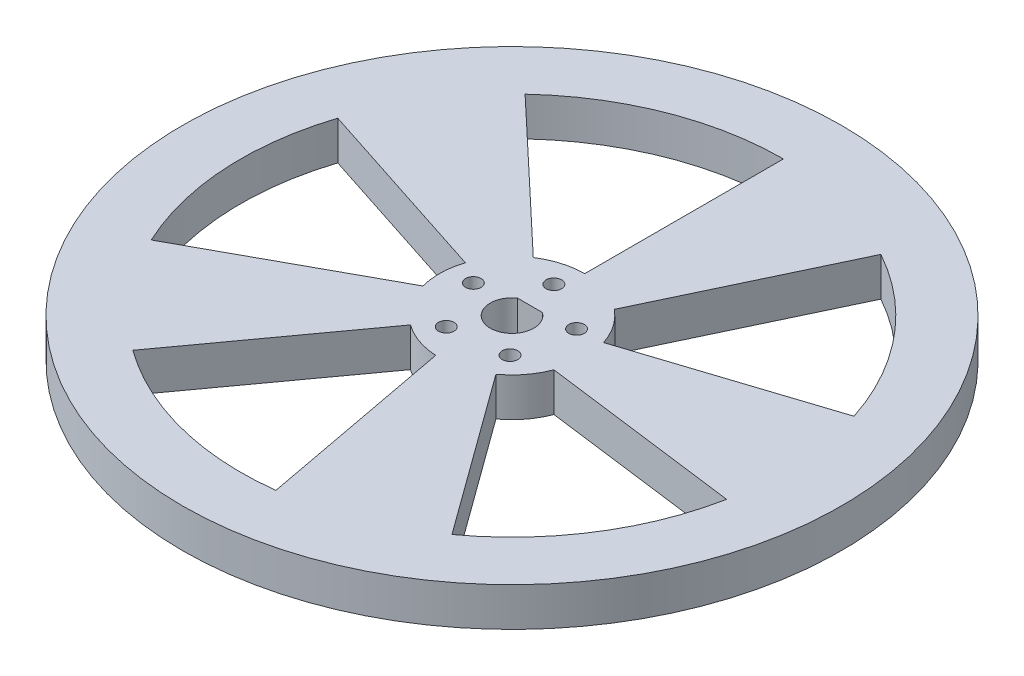
ISO-10303-21;
HEADER;
FILE_DESCRIPTION(('STEP AP214'),'2;1');
FILE_NAME('part.step','',(''),(''),'','','');
FILE_SCHEMA(('AUTOMOTIVE_DESIGN { 1 0 10303 214 1 1 1 1 }'));
ENDSEC;
DATA;
#1=APPLICATION_CONTEXT('core data for automotive mechanical design processes');
#2=APPLICATION_PROTOCOL_DEFINITION('international standard','automotive_design',2000,#1);
#3=PRODUCT_CONTEXT('',#1,'mechanical');
#4=PRODUCT('Part','Part','',(#3));
#5=PRODUCT_RELATED_PRODUCT_CATEGORY('part','',(#4));
#6=PRODUCT_DEFINITION_FORMATION('','',#4);
#7=PRODUCT_DEFINITION_CONTEXT('part definition',#1,'design');
#8=PRODUCT_DEFINITION('design','',#6,#7);
#9=PRODUCT_DEFINITION_SHAPE('','',#8);
#10=(LENGTH_UNIT() NAMED_UNIT(*) SI_UNIT(.MILLI.,.METRE.));
#11=(NAMED_UNIT(*) PLANE_ANGLE_UNIT() SI_UNIT($,.RADIAN.));
#12=(NAMED_UNIT(*) SI_UNIT($,.STERADIAN.) SOLID_ANGLE_UNIT());
#13=UNCERTAINTY_MEASURE_WITH_UNIT(LENGTH_MEASURE(1.E-05),#10,'distance_accuracy_value','');
#14=(GEOMETRIC_REPRESENTATION_CONTEXT(3) GLOBAL_UNCERTAINTY_ASSIGNED_CONTEXT((#13)) GLOBAL_UNIT_ASSIGNED_CONTEXT((#10,
#11,#12)) REPRESENTATION_CONTEXT('',''));
#15=CARTESIAN_POINT('',(0.,0.,0.));
#16=DIRECTION('',(0.,0.,1.));
#17=DIRECTION('',(1.,0.,0.));
#18=AXIS2_PLACEMENT_3D('',#15,#16,#17);
#19=CARTESIAN_POINT('',(0.,5.08,0.));
#20=DIRECTION('',(0.,1.,0.));
#21=DIRECTION('',(0.,0.,1.));
#22=AXIS2_PLACEMENT_3D('',#19,#20,#21);
#23=PLANE('',#22);
#24=CARTESIAN_POINT('',(-0.812554258388851,5.08,-6.29779767674178));
#25=DIRECTION('',(0.,1.,0.));
#26=DIRECTION('',(0.,0.,1.));
#27=AXIS2_PLACEMENT_3D('',#24,#25,#26);
#28=CIRCLE('',#27,1.016);
#29=CARTESIAN_POINT('',(-0.812554258388851,5.08,-5.28179767674178));
#30=VERTEX_POINT('',#29);
#31=EDGE_CURVE('E612',#30,#30,#28,.T.);
#32=ORIENTED_EDGE('',*,*,#31,.F.);
#33=EDGE_LOOP('',(#32));
#34=FACE_BOUND('',#33,.T.);
#35=CARTESIAN_POINT('',(-6.24065459346764,5.08,-1.17334148696418));
#36=DIRECTION('',(0.,1.,0.));
#37=DIRECTION('',(0.,0.,1.));
#38=AXIS2_PLACEMENT_3D('',#35,#36,#37);
#39=CIRCLE('',#38,1.016);
#40=CARTESIAN_POINT('',(-6.24065459346764,5.08,-0.15734148696418));
#41=VERTEX_POINT('',#40);
#42=EDGE_CURVE('E606',#41,#41,#39,.T.);
#43=ORIENTED_EDGE('',*,*,#42,.F.);
#44=EDGE_LOOP('',(#43));
#45=FACE_BOUND('',#44,.T.);
#46=CARTESIAN_POINT('',(-3.04438239242231,5.08,5.57263275738758));
#47=DIRECTION('',(0.,1.,0.));
#48=DIRECTION('',(0.,0.,1.));
#49=AXIS2_PLACEMENT_3D('',#46,#47,#48);
#50=CIRCLE('',#49,1.016);
#51=CARTESIAN_POINT('',(-3.04438239242231,5.08,6.58863275738758));
#52=VERTEX_POINT('',#51);
#53=EDGE_CURVE('E598',#52,#52,#50,.T.);
#54=ORIENTED_EDGE('',*,*,#53,.F.);
#55=EDGE_LOOP('',(#54));
#56=FACE_BOUND('',#55,.T.);
#57=CARTESIAN_POINT('',(4.35912280019893,5.08,4.61741793785075));
#58=DIRECTION('',(0.,1.,0.));
#59=DIRECTION('',(0.,0.,1.));
#60=AXIS2_PLACEMENT_3D('',#57,#58,#59);
#61=CIRCLE('',#60,1.016);
#62=CARTESIAN_POINT('',(4.35912280019893,5.08,5.63341793785075));
#63=VERTEX_POINT('',#62);
#64=EDGE_CURVE('E592',#63,#63,#61,.T.);
#65=ORIENTED_EDGE('',*,*,#64,.F.);
#66=EDGE_LOOP('',(#65));
#67=FACE_BOUND('',#66,.T.);
#68=CARTESIAN_POINT('',(5.73846844407986,5.08,-2.71891153153236));
#69=DIRECTION('',(0.,1.,0.));
#70=DIRECTION('',(0.,0.,1.));
#71=AXIS2_PLACEMENT_3D('',#68,#69,#70);
#72=CIRCLE('',#71,1.016);
#73=CARTESIAN_POINT('',(5.73846844407986,5.08,-1.70291153153236));
#74=VERTEX_POINT('',#73);
#75=EDGE_CURVE('E263',#74,#74,#72,.T.);
#76=ORIENTED_EDGE('',*,*,#75,.F.);
#77=EDGE_LOOP('',(#76));
#78=FACE_BOUND('',#77,.T.);
#79=CARTESIAN_POINT('',(0.,5.08,0.));
#80=DIRECTION('',(0.,1.,0.));
#81=DIRECTION('',(0.,0.,1.));
#82=AXIS2_PLACEMENT_3D('',#79,#80,#81);
#83=CIRCLE('',#82,43.18);
#84=CARTESIAN_POINT('',(0.,5.08,43.18));
#85=VERTEX_POINT('',#84);
#86=EDGE_CURVE('E12',#85,#85,#83,.T.);
#87=ORIENTED_EDGE('',*,*,#86,.T.);
#88=EDGE_LOOP('',(#87));
#89=FACE_BOUND('',#88,.T.);
#90=CARTESIAN_POINT('',(0.,5.08,0.));
#91=DIRECTION('',(0.,1.,0.));
#92=DIRECTION('',(0.,0.,1.));
#93=AXIS2_PLACEMENT_3D('',#90,#91,#92);
#94=CIRCLE('',#93,2.8575);
#95=CARTESIAN_POINT('',(-1.62639355630794,5.08,-2.3495));
#96=VERTEX_POINT('',#95);
#97=CARTESIAN_POINT('',(1.62639355630794,5.08,-2.3495));
#98=VERTEX_POINT('',#97);
#99=EDGE_CURVE('E402',#96,#98,#94,.T.);
#100=ORIENTED_EDGE('',*,*,#99,.F.);
#101=DIRECTION('',(1.,0.,0.));
#102=VECTOR('',#101,1.);
#103=CARTESIAN_POINT('',(0.,5.08,-2.3495));
#104=LINE('',#103,#102);
#105=EDGE_CURVE('E391',#96,#98,#104,.T.);
#106=ORIENTED_EDGE('',*,*,#105,.T.);
#107=EDGE_LOOP('',(#100,#106));
#108=FACE_BOUND('',#107,.T.);
#109=DIRECTION('',(0.951056516295154,0.,0.309016994374946));
#110=VECTOR('',#109,1.);
#111=CARTESIAN_POINT('',(0.,5.08,0.));
#112=LINE('',#111,#110);
#113=CARTESIAN_POINT('',(-33.8195697194556,5.08,-10.9886443199731));
#114=VERTEX_POINT('',#113);
#115=CARTESIAN_POINT('',(-9.05881331771133,5.08,-2.94338687142136));
#116=VERTEX_POINT('',#115);
#117=EDGE_CURVE('E381',#114,#116,#112,.T.);
#118=ORIENTED_EDGE('',*,*,#117,.T.);
#119=CARTESIAN_POINT('',(0.,5.08,0.));
#120=DIRECTION('',(0.,1.,0.));
#121=DIRECTION('',(0.,0.,1.));
#122=AXIS2_PLACEMENT_3D('',#119,#120,#121);
#123=CIRCLE('',#122,9.525);
#124=CARTESIAN_POINT('',(-9.19796228792312,5.08,2.47449282681197));
#125=VERTEX_POINT('',#124);
#126=EDGE_CURVE('E276',#116,#125,#123,.T.);
#127=ORIENTED_EDGE('',*,*,#126,.T.);
#128=DIRECTION('',(0.877518030629021,0.,-0.479543643395431));
#129=VECTOR('',#128,1.);
#130=CARTESIAN_POINT('',(-1.07389592150175,5.08,-1.9651246494778));
#131=LINE('',#130,#129);
#132=CARTESIAN_POINT('',(-32.2164981681078,5.08,15.0535990973688));
#133=VERTEX_POINT('',#132);
#134=EDGE_CURVE('E370',#133,#125,#131,.T.);
#135=ORIENTED_EDGE('',*,*,#134,.F.);
#136=CARTESIAN_POINT('',(0.,5.08,0.));
#137=DIRECTION('',(0.,1.,0.));
#138=DIRECTION('',(0.,0.,1.));
#139=AXIS2_PLACEMENT_3D('',#136,#137,#138);
#140=CIRCLE('',#139,35.56);
#141=EDGE_CURVE('E384',#114,#133,#140,.T.);
#142=ORIENTED_EDGE('',*,*,#141,.F.);
#143=EDGE_LOOP('',(#118,#127,#135,#142));
#144=FACE_BOUND('',#143,.T.);
#145=DIRECTION('',(0.587785252292471,0.,-0.809016994374949));
#146=VECTOR('',#145,1.);
#147=CARTESIAN_POINT('',(0.,5.08,0.));
#148=LINE('',#147,#146);
#149=CARTESIAN_POINT('',(-20.9016435715203,5.08,28.7686443199732));
#150=VERTEX_POINT('',#149);
#151=CARTESIAN_POINT('',(-5.59865452808579,5.08,7.70588687142138));
#152=VERTEX_POINT('',#151);
#153=EDGE_CURVE('E269',#150,#152,#148,.T.);
#154=ORIENTED_EDGE('',*,*,#153,.T.);
#155=CARTESIAN_POINT('',(0.,5.08,0.));
#156=DIRECTION('',(0.,1.,0.));
#157=DIRECTION('',(0.,0.,1.));
#158=AXIS2_PLACEMENT_3D('',#155,#156,#157);
#159=CIRCLE('',#158,9.525);
#160=CARTESIAN_POINT('',(-0.488944133122985,5.08,9.51244230651018));
#161=VERTEX_POINT('',#160);
#162=EDGE_CURVE('E250',#152,#161,#159,.T.);
#163=ORIENTED_EDGE('',*,*,#162,.T.);
#164=DIRECTION('',(-0.184905122564339,0.,-0.982756376549889));
#165=VECTOR('',#164,1.);
#166=CARTESIAN_POINT('',(-2.20079669315207,5.08,0.414078801213269));
#167=LINE('',#166,#165);
#168=CARTESIAN_POINT('',(4.36137808205273,5.08,35.2915284625842));
#169=VERTEX_POINT('',#168);
#170=EDGE_CURVE('E257',#169,#161,#167,.T.);
#171=ORIENTED_EDGE('',*,*,#170,.F.);
#172=CARTESIAN_POINT('',(0.,5.08,0.));
#173=DIRECTION('',(0.,1.,0.));
#174=DIRECTION('',(0.,0.,1.));
#175=AXIS2_PLACEMENT_3D('',#172,#173,#174);
#176=CIRCLE('',#175,35.56);
#177=EDGE_CURVE('E260',#150,#169,#176,.T.);
#178=ORIENTED_EDGE('',*,*,#177,.F.);
#179=EDGE_LOOP('',(#154,#163,#171,#178));
#180=FACE_BOUND('',#179,.T.);
#181=DIRECTION('',(-0.587785252292475,0.,-0.809016994374946));
#182=VECTOR('',#181,1.);
#183=CARTESIAN_POINT('',(0.,5.08,0.));
#184=LINE('',#183,#182);
#185=CARTESIAN_POINT('',(20.9016435715204,5.08,28.7686443199731));
#186=VERTEX_POINT('',#185);
#187=CARTESIAN_POINT('',(5.59865452808581,5.08,7.70588687142136));
#188=VERTEX_POINT('',#187);
#189=EDGE_CURVE('E295',#186,#188,#184,.T.);
#190=ORIENTED_EDGE('',*,*,#189,.T.);
#191=CARTESIAN_POINT('',(0.,5.08,0.));
#192=DIRECTION('',(0.,1.,0.));
#193=DIRECTION('',(0.,0.,1.));
#194=AXIS2_PLACEMENT_3D('',#191,#192,#193);
#195=CIRCLE('',#194,9.525);
#196=CARTESIAN_POINT('',(8.89497678424152,5.08,3.40661312857861));
#197=VERTEX_POINT('',#196);
#198=EDGE_CURVE('E292',#188,#197,#195,.T.);
#199=ORIENTED_EDGE('',*,*,#198,.T.);
#200=DIRECTION('',(-0.991639136550545,0.,-0.129041942256348));
#201=VECTOR('',#200,1.);
#202=CARTESIAN_POINT('',(-0.287802994944483,5.08,2.21165853840337));
#203=LINE('',#202,#201);
#204=CARTESIAN_POINT('',(34.9054592868704,5.08,6.79135568002683));
#205=VERTEX_POINT('',#204);
#206=EDGE_CURVE('E283',#205,#197,#203,.T.);
#207=ORIENTED_EDGE('',*,*,#206,.F.);
#208=CARTESIAN_POINT('',(0.,5.08,0.));
#209=DIRECTION('',(0.,1.,0.));
#210=DIRECTION('',(0.,0.,1.));
#211=AXIS2_PLACEMENT_3D('',#208,#209,#210);
#212=CIRCLE('',#211,35.56);
#213=EDGE_CURVE('E299',#186,#205,#212,.T.);
#214=ORIENTED_EDGE('',*,*,#213,.F.);
#215=EDGE_LOOP('',(#190,#199,#207,#214));
#216=FACE_BOUND('',#215,.T.);
#217=DIRECTION('',(-0.951056516295153,0.,0.309016994374949));
#218=VECTOR('',#217,1.);
#219=CARTESIAN_POINT('',(0.,5.08,0.));
#220=LINE('',#219,#218);
#221=CARTESIAN_POINT('',(33.8195697194556,5.08,-10.9886443199732));
#222=VERTEX_POINT('',#221);
#223=CARTESIAN_POINT('',(9.05881331771133,5.08,-2.94338687142138));
#224=VERTEX_POINT('',#223);
#225=EDGE_CURVE('E324',#222,#224,#220,.T.);
#226=ORIENTED_EDGE('',*,*,#225,.T.);
#227=CARTESIAN_POINT('',(0.,5.08,0.));
#228=DIRECTION('',(0.,1.,0.));
#229=DIRECTION('',(0.,0.,1.));
#230=AXIS2_PLACEMENT_3D('',#227,#228,#229);
#231=CIRCLE('',#230,9.525);
#232=CARTESIAN_POINT('',(5.98683741404609,5.08,-7.40833333333333));
#233=VERTEX_POINT('',#232);
#234=EDGE_CURVE('E104',#224,#233,#231,.T.);
#235=ORIENTED_EDGE('',*,*,#234,.T.);
#236=DIRECTION('',(-0.42805831823088,0.,0.903751114075856));
#237=VECTOR('',#236,1.);
#238=CARTESIAN_POINT('',(2.02387133856432,5.08,0.958599052336888));
#239=LINE('',#238,#237);
#240=CARTESIAN_POINT('',(17.2154109738919,5.08,-31.115));
#241=VERTEX_POINT('',#240);
#242=EDGE_CURVE('E314',#241,#233,#239,.T.);
#243=ORIENTED_EDGE('',*,*,#242,.F.);
#244=CARTESIAN_POINT('',(0.,5.08,0.));
#245=DIRECTION('',(0.,1.,0.));
#246=DIRECTION('',(0.,0.,1.));
#247=AXIS2_PLACEMENT_3D('',#244,#245,#246);
#248=CIRCLE('',#247,35.56);
#249=EDGE_CURVE('E328',#222,#241,#248,.T.);
#250=ORIENTED_EDGE('',*,*,#249,.F.);
#251=EDGE_LOOP('',(#226,#235,#243,#250));
#252=FACE_BOUND('',#251,.T.);
#253=DIRECTION('',(0.,0.,1.));
#254=VECTOR('',#253,1.);
#255=CARTESIAN_POINT('',(0.,5.08,0.));
#256=LINE('',#255,#254);
#257=CARTESIAN_POINT('',(0.,5.08,-35.56));
#258=VERTEX_POINT('',#257);
#259=CARTESIAN_POINT('',(0.,5.08,-9.52499999999999));
#260=VERTEX_POINT('',#259);
#261=EDGE_CURVE('E352',#258,#260,#256,.T.);
#262=ORIENTED_EDGE('',*,*,#261,.T.);
#263=CARTESIAN_POINT('',(0.,5.08,0.));
#264=DIRECTION('',(0.,1.,0.));
#265=DIRECTION('',(0.,0.,1.));
#266=AXIS2_PLACEMENT_3D('',#263,#264,#265);
#267=CIRCLE('',#266,9.525);
#268=CARTESIAN_POINT('',(-5.19570918805325,5.08,-7.98312163462256));
#269=VERTEX_POINT('',#268);
#270=EDGE_CURVE('E96',#260,#269,#267,.T.);
#271=ORIENTED_EDGE('',*,*,#270,.T.);
#272=DIRECTION('',(0.727241091233947,0.,0.686382105842554));
#273=VECTOR('',#272,1.);
#274=CARTESIAN_POINT('',(1.5370925132841,5.08,-1.62859262672077));
#275=LINE('',#274,#273);
#276=CARTESIAN_POINT('',(-24.2722689484421,5.08,-25.9878925673955));
#277=VERTEX_POINT('',#276);
#278=EDGE_CURVE('E342',#277,#269,#275,.T.);
#279=ORIENTED_EDGE('',*,*,#278,.F.);
#280=CARTESIAN_POINT('',(0.,5.08,0.));
#281=DIRECTION('',(0.,1.,0.));
#282=DIRECTION('',(0.,0.,1.));
#283=AXIS2_PLACEMENT_3D('',#280,#281,#282);
#284=CIRCLE('',#283,35.56);
#285=EDGE_CURVE('E356',#258,#277,#284,.T.);
#286=ORIENTED_EDGE('',*,*,#285,.F.);
#287=EDGE_LOOP('',(#262,#271,#279,#286));
#288=FACE_BOUND('',#287,.T.);
#289=ADVANCED_FACE('F81',(#34,#45,#56,#67,#78,#89,#108,#144,#180,#216,#252,#288),#23,.T.);
#290=CARTESIAN_POINT('',(0.,0.,0.));
#291=DIRECTION('',(0.,1.,0.));
#292=DIRECTION('',(0.,0.,1.));
#293=AXIS2_PLACEMENT_3D('',#290,#291,#292);
#294=PLANE('',#293);
#295=CARTESIAN_POINT('',(-0.812554258388851,0.,-6.29779767674178));
#296=DIRECTION('',(0.,1.,0.));
#297=DIRECTION('',(0.,0.,1.));
#298=AXIS2_PLACEMENT_3D('',#295,#296,#297);
#299=CIRCLE('',#298,1.016);
#300=CARTESIAN_POINT('',(-0.812554258388851,0.,-5.28179767674178));
#301=VERTEX_POINT('',#300);
#302=EDGE_CURVE('E609',#301,#301,#299,.T.);
#303=ORIENTED_EDGE('',*,*,#302,.T.);
#304=EDGE_LOOP('',(#303));
#305=FACE_BOUND('',#304,.T.);
#306=CARTESIAN_POINT('',(-6.24065459346764,0.,-1.17334148696418));
#307=DIRECTION('',(0.,1.,0.));
#308=DIRECTION('',(0.,0.,1.));
#309=AXIS2_PLACEMENT_3D('',#306,#307,#308);
#310=CIRCLE('',#309,1.016);
#311=CARTESIAN_POINT('',(-6.24065459346764,0.,-0.15734148696418));
#312=VERTEX_POINT('',#311);
#313=EDGE_CURVE('E603',#312,#312,#310,.T.);
#314=ORIENTED_EDGE('',*,*,#313,.T.);
#315=EDGE_LOOP('',(#314));
#316=FACE_BOUND('',#315,.T.);
#317=CARTESIAN_POINT('',(-3.04438239242231,0.,5.57263275738758));
#318=DIRECTION('',(0.,1.,0.));
#319=DIRECTION('',(0.,0.,1.));
#320=AXIS2_PLACEMENT_3D('',#317,#318,#319);
#321=CIRCLE('',#320,1.016);
#322=CARTESIAN_POINT('',(-3.04438239242231,0.,6.58863275738758));
#323=VERTEX_POINT('',#322);
#324=EDGE_CURVE('E594',#323,#323,#321,.T.);
#325=ORIENTED_EDGE('',*,*,#324,.T.);
#326=EDGE_LOOP('',(#325));
#327=FACE_BOUND('',#326,.T.);
#328=CARTESIAN_POINT('',(4.35912280019893,0.,4.61741793785075));
#329=DIRECTION('',(0.,1.,0.));
#330=DIRECTION('',(0.,0.,1.));
#331=AXIS2_PLACEMENT_3D('',#328,#329,#330);
#332=CIRCLE('',#331,1.016);
#333=CARTESIAN_POINT('',(4.35912280019893,0.,5.63341793785075));
#334=VERTEX_POINT('',#333);
#335=EDGE_CURVE('E589',#334,#334,#332,.T.);
#336=ORIENTED_EDGE('',*,*,#335,.T.);
#337=EDGE_LOOP('',(#336));
#338=FACE_BOUND('',#337,.T.);
#339=CARTESIAN_POINT('',(5.73846844407986,0.,-2.71891153153236));
#340=DIRECTION('',(0.,1.,0.));
#341=DIRECTION('',(0.,0.,1.));
#342=AXIS2_PLACEMENT_3D('',#339,#340,#341);
#343=CIRCLE('',#342,1.016);
#344=CARTESIAN_POINT('',(5.73846844407986,0.,-1.70291153153236));
#345=VERTEX_POINT('',#344);
#346=EDGE_CURVE('E353',#345,#345,#343,.T.);
#347=ORIENTED_EDGE('',*,*,#346,.T.);
#348=EDGE_LOOP('',(#347));
#349=FACE_BOUND('',#348,.T.);
#350=CARTESIAN_POINT('',(0.,0.,0.));
#351=DIRECTION('',(0.,1.,0.));
#352=DIRECTION('',(0.,0.,1.));
#353=AXIS2_PLACEMENT_3D('',#350,#351,#352);
#354=CIRCLE('',#353,9.525);
#355=CARTESIAN_POINT('',(9.05881331771133,0.,-2.94338687142138));
#356=VERTEX_POINT('',#355);
#357=CARTESIAN_POINT('',(5.98683741404609,0.,-7.40833333333333));
#358=VERTEX_POINT('',#357);
#359=EDGE_CURVE('E311',#356,#358,#354,.T.);
#360=ORIENTED_EDGE('',*,*,#359,.F.);
#361=DIRECTION('',(-0.951056516295153,0.,0.309016994374949));
#362=VECTOR('',#361,1.);
#363=CARTESIAN_POINT('',(0.,0.,0.));
#364=LINE('',#363,#362);
#365=CARTESIAN_POINT('',(33.8195697194556,0.,-10.9886443199732));
#366=VERTEX_POINT('',#365);
#367=EDGE_CURVE('E313',#366,#356,#364,.T.);
#368=ORIENTED_EDGE('',*,*,#367,.F.);
#369=CARTESIAN_POINT('',(0.,0.,0.));
#370=DIRECTION('',(0.,1.,0.));
#371=DIRECTION('',(0.,0.,1.));
#372=AXIS2_PLACEMENT_3D('',#369,#370,#371);
#373=CIRCLE('',#372,35.56);
#374=CARTESIAN_POINT('',(17.2154109738919,0.,-31.115));
#375=VERTEX_POINT('',#374);
#376=EDGE_CURVE('E316',#366,#375,#373,.T.);
#377=ORIENTED_EDGE('',*,*,#376,.T.);
#378=DIRECTION('',(-0.42805831823088,0.,0.903751114075856));
#379=VECTOR('',#378,1.);
#380=CARTESIAN_POINT('',(2.02387133856432,0.,0.958599052336888));
#381=LINE('',#380,#379);
#382=EDGE_CURVE('E319',#375,#358,#381,.T.);
#383=ORIENTED_EDGE('',*,*,#382,.T.);
#384=EDGE_LOOP('',(#360,#368,#377,#383));
#385=FACE_BOUND('',#384,.T.);
#386=CARTESIAN_POINT('',(0.,0.,0.));
#387=DIRECTION('',(0.,1.,0.));
#388=DIRECTION('',(0.,0.,1.));
#389=AXIS2_PLACEMENT_3D('',#386,#387,#388);
#390=CIRCLE('',#389,9.525);
#391=CARTESIAN_POINT('',(-5.59865452808579,0.,7.70588687142138));
#392=VERTEX_POINT('',#391);
#393=CARTESIAN_POINT('',(-0.488944133122985,0.,9.51244230651018));
#394=VERTEX_POINT('',#393);
#395=EDGE_CURVE('E244',#392,#394,#390,.T.);
#396=ORIENTED_EDGE('',*,*,#395,.F.);
#397=DIRECTION('',(0.587785252292471,0.,-0.809016994374949));
#398=VECTOR('',#397,1.);
#399=CARTESIAN_POINT('',(0.,0.,0.));
#400=LINE('',#399,#398);
#401=CARTESIAN_POINT('',(-20.9016435715203,0.,28.7686443199732));
#402=VERTEX_POINT('',#401);
#403=EDGE_CURVE('E233',#402,#392,#400,.T.);
#404=ORIENTED_EDGE('',*,*,#403,.F.);
#405=CARTESIAN_POINT('',(0.,0.,0.));
#406=DIRECTION('',(0.,1.,0.));
#407=DIRECTION('',(0.,0.,1.));
#408=AXIS2_PLACEMENT_3D('',#405,#406,#407);
#409=CIRCLE('',#408,35.56);
#410=CARTESIAN_POINT('',(4.36137808205273,0.,35.2915284625842));
#411=VERTEX_POINT('',#410);
#412=EDGE_CURVE('E243',#402,#411,#409,.T.);
#413=ORIENTED_EDGE('',*,*,#412,.T.);
#414=DIRECTION('',(-0.184905122564339,0.,-0.982756376549889));
#415=VECTOR('',#414,1.);
#416=CARTESIAN_POINT('',(-2.20079669315207,0.,0.414078801213269));
#417=LINE('',#416,#415);
#418=EDGE_CURVE('E251',#411,#394,#417,.T.);
#419=ORIENTED_EDGE('',*,*,#418,.T.);
#420=EDGE_LOOP('',(#396,#404,#413,#419));
#421=FACE_BOUND('',#420,.T.);
#422=DIRECTION('',(1.,0.,0.));
#423=VECTOR('',#422,1.);
#424=CARTESIAN_POINT('',(0.,0.,-2.3495));
#425=LINE('',#424,#423);
#426=CARTESIAN_POINT('',(-1.62639355630794,0.,-2.3495));
#427=VERTEX_POINT('',#426);
#428=CARTESIAN_POINT('',(1.62639355630794,0.,-2.3495));
#429=VERTEX_POINT('',#428);
#430=EDGE_CURVE('E398',#427,#429,#425,.T.);
#431=ORIENTED_EDGE('',*,*,#430,.F.);
#432=CARTESIAN_POINT('',(0.,0.,0.));
#433=DIRECTION('',(0.,1.,0.));
#434=DIRECTION('',(0.,0.,1.));
#435=AXIS2_PLACEMENT_3D('',#432,#433,#434);
#436=CIRCLE('',#435,2.8575);
#437=EDGE_CURVE('E401',#427,#429,#436,.T.);
#438=ORIENTED_EDGE('',*,*,#437,.T.);
#439=EDGE_LOOP('',(#431,#438));
#440=FACE_BOUND('',#439,.T.);
#441=CARTESIAN_POINT('',(0.,0.,0.));
#442=DIRECTION('',(0.,1.,0.));
#443=DIRECTION('',(0.,0.,1.));
#444=AXIS2_PLACEMENT_3D('',#441,#442,#443);
#445=CIRCLE('',#444,43.18);
#446=CARTESIAN_POINT('',(0.,0.,43.18));
#447=VERTEX_POINT('',#446);
#448=EDGE_CURVE('E85',#447,#447,#445,.T.);
#449=ORIENTED_EDGE('',*,*,#448,.F.);
#450=EDGE_LOOP('',(#449));
#451=FACE_BOUND('',#450,.T.);
#452=CARTESIAN_POINT('',(0.,0.,0.));
#453=DIRECTION('',(0.,1.,0.));
#454=DIRECTION('',(0.,0.,1.));
#455=AXIS2_PLACEMENT_3D('',#452,#453,#454);
#456=CIRCLE('',#455,9.525);
#457=CARTESIAN_POINT('',(-9.05881331771133,0.,-2.94338687142136));
#458=VERTEX_POINT('',#457);
#459=CARTESIAN_POINT('',(-9.19796228792312,0.,2.47449282681197));
#460=VERTEX_POINT('',#459);
#461=EDGE_CURVE('E367',#458,#460,#456,.T.);
#462=ORIENTED_EDGE('',*,*,#461,.F.);
#463=DIRECTION('',(0.951056516295154,0.,0.309016994374946));
#464=VECTOR('',#463,1.);
#465=CARTESIAN_POINT('',(0.,0.,0.));
#466=LINE('',#465,#464);
#467=CARTESIAN_POINT('',(-33.8195697194556,0.,-10.9886443199731));
#468=VERTEX_POINT('',#467);
#469=EDGE_CURVE('E369',#468,#458,#466,.T.);
#470=ORIENTED_EDGE('',*,*,#469,.F.);
#471=CARTESIAN_POINT('',(0.,0.,0.));
#472=DIRECTION('',(0.,1.,0.));
#473=DIRECTION('',(0.,0.,1.));
#474=AXIS2_PLACEMENT_3D('',#471,#472,#473);
#475=CIRCLE('',#474,35.56);
#476=CARTESIAN_POINT('',(-32.2164981681078,0.,15.0535990973688));
#477=VERTEX_POINT('',#476);
#478=EDGE_CURVE('E372',#468,#477,#475,.T.);
#479=ORIENTED_EDGE('',*,*,#478,.T.);
#480=DIRECTION('',(0.877518030629021,0.,-0.479543643395431));
#481=VECTOR('',#480,1.);
#482=CARTESIAN_POINT('',(-1.07389592150175,0.,-1.9651246494778));
#483=LINE('',#482,#481);
#484=EDGE_CURVE('E375',#477,#460,#483,.T.);
#485=ORIENTED_EDGE('',*,*,#484,.T.);
#486=EDGE_LOOP('',(#462,#470,#479,#485));
#487=FACE_BOUND('',#486,.T.);
#488=CARTESIAN_POINT('',(0.,0.,0.));
#489=DIRECTION('',(0.,1.,0.));
#490=DIRECTION('',(0.,0.,1.));
#491=AXIS2_PLACEMENT_3D('',#488,#489,#490);
#492=CIRCLE('',#491,9.525);
#493=CARTESIAN_POINT('',(5.59865452808581,0.,7.70588687142136));
#494=VERTEX_POINT('',#493);
#495=CARTESIAN_POINT('',(8.89497678424152,0.,3.40661312857861));
#496=VERTEX_POINT('',#495);
#497=EDGE_CURVE('E280',#494,#496,#492,.T.);
#498=ORIENTED_EDGE('',*,*,#497,.F.);
#499=DIRECTION('',(-0.587785252292475,0.,-0.809016994374946));
#500=VECTOR('',#499,1.);
#501=CARTESIAN_POINT('',(0.,0.,0.));
#502=LINE('',#501,#500);
#503=CARTESIAN_POINT('',(20.9016435715204,0.,28.7686443199731));
#504=VERTEX_POINT('',#503);
#505=EDGE_CURVE('E282',#504,#494,#502,.T.);
#506=ORIENTED_EDGE('',*,*,#505,.F.);
#507=CARTESIAN_POINT('',(0.,0.,0.));
#508=DIRECTION('',(0.,1.,0.));
#509=DIRECTION('',(0.,0.,1.));
#510=AXIS2_PLACEMENT_3D('',#507,#508,#509);
#511=CIRCLE('',#510,35.56);
#512=CARTESIAN_POINT('',(34.9054592868704,0.,6.79135568002683));
#513=VERTEX_POINT('',#512);
#514=EDGE_CURVE('E285',#504,#513,#511,.T.);
#515=ORIENTED_EDGE('',*,*,#514,.T.);
#516=DIRECTION('',(-0.991639136550545,0.,-0.129041942256348));
#517=VECTOR('',#516,1.);
#518=CARTESIAN_POINT('',(-0.287802994944483,0.,2.21165853840337));
#519=LINE('',#518,#517);
#520=EDGE_CURVE('E288',#513,#496,#519,.T.);
#521=ORIENTED_EDGE('',*,*,#520,.T.);
#522=EDGE_LOOP('',(#498,#506,#515,#521));
#523=FACE_BOUND('',#522,.T.);
#524=CARTESIAN_POINT('',(0.,0.,0.));
#525=DIRECTION('',(0.,1.,0.));
#526=DIRECTION('',(0.,0.,1.));
#527=AXIS2_PLACEMENT_3D('',#524,#525,#526);
#528=CIRCLE('',#527,9.525);
#529=CARTESIAN_POINT('',(0.,0.,-9.52499999999999));
#530=VERTEX_POINT('',#529);
#531=CARTESIAN_POINT('',(-5.19570918805325,0.,-7.98312163462256));
#532=VERTEX_POINT('',#531);
#533=EDGE_CURVE('E339',#530,#532,#528,.T.);
#534=ORIENTED_EDGE('',*,*,#533,.F.);
#535=DIRECTION('',(0.,0.,1.));
#536=VECTOR('',#535,1.);
#537=CARTESIAN_POINT('',(0.,0.,0.));
#538=LINE('',#537,#536);
#539=CARTESIAN_POINT('',(0.,0.,-35.56));
#540=VERTEX_POINT('',#539);
#541=EDGE_CURVE('E341',#540,#530,#538,.T.);
#542=ORIENTED_EDGE('',*,*,#541,.F.);
#543=CARTESIAN_POINT('',(0.,0.,0.));
#544=DIRECTION('',(0.,1.,0.));
#545=DIRECTION('',(0.,0.,1.));
#546=AXIS2_PLACEMENT_3D('',#543,#544,#545);
#547=CIRCLE('',#546,35.56);
#548=CARTESIAN_POINT('',(-24.2722689484421,0.,-25.9878925673955));
#549=VERTEX_POINT('',#548);
#550=EDGE_CURVE('E344',#540,#549,#547,.T.);
#551=ORIENTED_EDGE('',*,*,#550,.T.);
#552=DIRECTION('',(0.727241091233947,0.,0.686382105842554));
#553=VECTOR('',#552,1.);
#554=CARTESIAN_POINT('',(1.5370925132841,0.,-1.62859262672077));
#555=LINE('',#554,#553);
#556=EDGE_CURVE('E347',#549,#532,#555,.T.);
#557=ORIENTED_EDGE('',*,*,#556,.T.);
#558=EDGE_LOOP('',(#534,#542,#551,#557));
#559=FACE_BOUND('',#558,.T.);
#560=ADVANCED_FACE('F254',(#305,#316,#327,#338,#349,#385,#421,#440,#451,#487,#523,#559),#294,.F.);
#561=CARTESIAN_POINT('',(0.,5.08,0.));
#562=DIRECTION('',(0.,-1.,0.));
#563=DIRECTION('',(0.,0.,-1.));
#564=AXIS2_PLACEMENT_3D('',#561,#562,#563);
#565=CYLINDRICAL_SURFACE('',#564,43.18);
#566=ORIENTED_EDGE('',*,*,#86,.F.);
#567=EDGE_LOOP('',(#566));
#568=FACE_BOUND('',#567,.T.);
#569=ORIENTED_EDGE('',*,*,#448,.T.);
#570=EDGE_LOOP('',(#569));
#571=FACE_BOUND('',#570,.T.);
#572=ADVANCED_FACE('F83',(#568,#571),#565,.T.);
#573=CARTESIAN_POINT('',(0.,0.,-2.3495));
#574=DIRECTION('',(0.,0.,1.));
#575=DIRECTION('',(1.,0.,0.));
#576=AXIS2_PLACEMENT_3D('',#573,#574,#575);
#577=PLANE('',#576);
#578=ORIENTED_EDGE('',*,*,#105,.F.);
#579=DIRECTION('',(0.,1.,0.));
#580=VECTOR('',#579,1.);
#581=CARTESIAN_POINT('',(-1.62639355630794,0.,-2.3495));
#582=LINE('',#581,#580);
#583=EDGE_CURVE('E405',#427,#96,#582,.T.);
#584=ORIENTED_EDGE('',*,*,#583,.F.);
#585=ORIENTED_EDGE('',*,*,#430,.T.);
#586=DIRECTION('',(0.,1.,0.));
#587=VECTOR('',#586,1.);
#588=CARTESIAN_POINT('',(1.62639355630794,0.,-2.3495));
#589=LINE('',#588,#587);
#590=EDGE_CURVE('E410',#429,#98,#589,.T.);
#591=ORIENTED_EDGE('',*,*,#590,.T.);
#592=EDGE_LOOP('',(#578,#584,#585,#591));
#593=FACE_BOUND('',#592,.T.);
#594=ADVANCED_FACE('F421',(#593),#577,.T.);
#595=CARTESIAN_POINT('',(0.,0.,0.));
#596=DIRECTION('',(0.,1.,0.));
#597=DIRECTION('',(0.,0.,1.));
#598=AXIS2_PLACEMENT_3D('',#595,#596,#597);
#599=CYLINDRICAL_SURFACE('',#598,2.8575);
#600=ORIENTED_EDGE('',*,*,#99,.T.);
#601=ORIENTED_EDGE('',*,*,#590,.F.);
#602=ORIENTED_EDGE('',*,*,#437,.F.);
#603=ORIENTED_EDGE('',*,*,#583,.T.);
#604=EDGE_LOOP('',(#600,#601,#602,#603));
#605=FACE_BOUND('',#604,.T.);
#606=ADVANCED_FACE('F416',(#605),#599,.F.);
#607=CARTESIAN_POINT('',(0.,0.,0.));
#608=DIRECTION('',(0.,1.,0.));
#609=DIRECTION('',(0.,0.,1.));
#610=AXIS2_PLACEMENT_3D('',#607,#608,#609);
#611=CYLINDRICAL_SURFACE('',#610,9.525);
#612=ORIENTED_EDGE('',*,*,#126,.F.);
#613=DIRECTION('',(0.,1.,0.));
#614=VECTOR('',#613,1.);
#615=CARTESIAN_POINT('',(-9.05881331771133,0.,-2.94338687142136));
#616=LINE('',#615,#614);
#617=EDGE_CURVE('E378',#458,#116,#616,.T.);
#618=ORIENTED_EDGE('',*,*,#617,.F.);
#619=ORIENTED_EDGE('',*,*,#461,.T.);
#620=DIRECTION('',(0.,1.,0.));
#621=VECTOR('',#620,1.);
#622=CARTESIAN_POINT('',(-9.19796228792312,0.,2.47449282681197));
#623=LINE('',#622,#621);
#624=EDGE_CURVE('E389',#460,#125,#623,.T.);
#625=ORIENTED_EDGE('',*,*,#624,.T.);
#626=EDGE_LOOP('',(#612,#618,#619,#625));
#627=FACE_BOUND('',#626,.T.);
#628=ADVANCED_FACE('F471',(#627),#611,.T.);
#629=CARTESIAN_POINT('',(-1.07389592150175,0.,-1.9651246494778));
#630=DIRECTION('',(0.479543643395431,0.,0.877518030629021));
#631=DIRECTION('',(0.877518030629021,0.,-0.479543643395431));
#632=AXIS2_PLACEMENT_3D('',#629,#630,#631);
#633=PLANE('',#632);
#634=ORIENTED_EDGE('',*,*,#134,.T.);
#635=ORIENTED_EDGE('',*,*,#624,.F.);
#636=ORIENTED_EDGE('',*,*,#484,.F.);
#637=DIRECTION('',(0.,1.,0.));
#638=VECTOR('',#637,1.);
#639=CARTESIAN_POINT('',(-32.2164981681078,0.,15.0535990973688));
#640=LINE('',#639,#638);
#641=EDGE_CURVE('E392',#477,#133,#640,.T.);
#642=ORIENTED_EDGE('',*,*,#641,.T.);
#643=EDGE_LOOP('',(#634,#635,#636,#642));
#644=FACE_BOUND('',#643,.T.);
#645=ADVANCED_FACE('F474',(#644),#633,.F.);
#646=CARTESIAN_POINT('',(0.,0.,0.));
#647=DIRECTION('',(0.,1.,0.));
#648=DIRECTION('',(0.,0.,1.));
#649=AXIS2_PLACEMENT_3D('',#646,#647,#648);
#650=CYLINDRICAL_SURFACE('',#649,35.56);
#651=ORIENTED_EDGE('',*,*,#141,.T.);
#652=ORIENTED_EDGE('',*,*,#641,.F.);
#653=ORIENTED_EDGE('',*,*,#478,.F.);
#654=DIRECTION('',(0.,1.,0.));
#655=VECTOR('',#654,1.);
#656=CARTESIAN_POINT('',(-33.8195697194556,0.,-10.9886443199731));
#657=LINE('',#656,#655);
#658=EDGE_CURVE('E394',#468,#114,#657,.T.);
#659=ORIENTED_EDGE('',*,*,#658,.T.);
#660=EDGE_LOOP('',(#651,#652,#653,#659));
#661=FACE_BOUND('',#660,.T.);
#662=ADVANCED_FACE('F479',(#661),#650,.F.);
#663=CARTESIAN_POINT('',(0.,0.,0.));
#664=DIRECTION('',(-0.309016994374946,0.,0.951056516295154));
#665=DIRECTION('',(0.951056516295154,0.,0.309016994374946));
#666=AXIS2_PLACEMENT_3D('',#663,#664,#665);
#667=PLANE('',#666);
#668=ORIENTED_EDGE('',*,*,#117,.F.);
#669=ORIENTED_EDGE('',*,*,#658,.F.);
#670=ORIENTED_EDGE('',*,*,#469,.T.);
#671=ORIENTED_EDGE('',*,*,#617,.T.);
#672=EDGE_LOOP('',(#668,#669,#670,#671));
#673=FACE_BOUND('',#672,.T.);
#674=ADVANCED_FACE('F476',(#673),#667,.T.);
#675=CARTESIAN_POINT('',(0.,0.,0.));
#676=DIRECTION('',(0.,1.,0.));
#677=DIRECTION('',(0.,0.,1.));
#678=AXIS2_PLACEMENT_3D('',#675,#676,#677);
#679=CYLINDRICAL_SURFACE('',#678,9.525);
#680=ORIENTED_EDGE('',*,*,#162,.F.);
#681=DIRECTION('',(0.,1.,0.));
#682=VECTOR('',#681,1.);
#683=CARTESIAN_POINT('',(-5.59865452808579,0.,7.70588687142138));
#684=LINE('',#683,#682);
#685=EDGE_CURVE('E237',#392,#152,#684,.T.);
#686=ORIENTED_EDGE('',*,*,#685,.F.);
#687=ORIENTED_EDGE('',*,*,#395,.T.);
#688=DIRECTION('',(0.,1.,0.));
#689=VECTOR('',#688,1.);
#690=CARTESIAN_POINT('',(-0.488944133122985,0.,9.51244230651018));
#691=LINE('',#690,#689);
#692=EDGE_CURVE('E274',#394,#161,#691,.T.);
#693=ORIENTED_EDGE('',*,*,#692,.T.);
#694=EDGE_LOOP('',(#680,#686,#687,#693));
#695=FACE_BOUND('',#694,.T.);
#696=ADVANCED_FACE('F247',(#695),#679,.T.);
#697=CARTESIAN_POINT('',(-2.20079669315207,0.,0.414078801213269));
#698=DIRECTION('',(0.982756376549889,0.,-0.184905122564339));
#699=DIRECTION('',(-0.184905122564339,0.,-0.982756376549889));
#700=AXIS2_PLACEMENT_3D('',#697,#698,#699);
#701=PLANE('',#700);
#702=ORIENTED_EDGE('',*,*,#170,.T.);
#703=ORIENTED_EDGE('',*,*,#692,.F.);
#704=ORIENTED_EDGE('',*,*,#418,.F.);
#705=DIRECTION('',(0.,1.,0.));
#706=VECTOR('',#705,1.);
#707=CARTESIAN_POINT('',(4.36137808205273,0.,35.2915284625842));
#708=LINE('',#707,#706);
#709=EDGE_CURVE('E277',#411,#169,#708,.T.);
#710=ORIENTED_EDGE('',*,*,#709,.T.);
#711=EDGE_LOOP('',(#702,#703,#704,#710));
#712=FACE_BOUND('',#711,.T.);
#713=ADVANCED_FACE('F553',(#712),#701,.F.);
#714=CARTESIAN_POINT('',(0.,0.,0.));
#715=DIRECTION('',(0.,1.,0.));
#716=DIRECTION('',(0.,0.,1.));
#717=AXIS2_PLACEMENT_3D('',#714,#715,#716);
#718=CYLINDRICAL_SURFACE('',#717,35.56);
#719=ORIENTED_EDGE('',*,*,#177,.T.);
#720=ORIENTED_EDGE('',*,*,#709,.F.);
#721=ORIENTED_EDGE('',*,*,#412,.F.);
#722=DIRECTION('',(0.,1.,0.));
#723=VECTOR('',#722,1.);
#724=CARTESIAN_POINT('',(-20.9016435715203,0.,28.7686443199732));
#725=LINE('',#724,#723);
#726=EDGE_CURVE('E239',#402,#150,#725,.T.);
#727=ORIENTED_EDGE('',*,*,#726,.T.);
#728=EDGE_LOOP('',(#719,#720,#721,#727));
#729=FACE_BOUND('',#728,.T.);
#730=ADVANCED_FACE('F532',(#729),#718,.F.);
#731=CARTESIAN_POINT('',(0.,0.,0.));
#732=DIRECTION('',(0.809016994374949,0.,0.587785252292471));
#733=DIRECTION('',(0.587785252292471,0.,-0.809016994374949));
#734=AXIS2_PLACEMENT_3D('',#731,#732,#733);
#735=PLANE('',#734);
#736=ORIENTED_EDGE('',*,*,#153,.F.);
#737=ORIENTED_EDGE('',*,*,#726,.F.);
#738=ORIENTED_EDGE('',*,*,#403,.T.);
#739=ORIENTED_EDGE('',*,*,#685,.T.);
#740=EDGE_LOOP('',(#736,#737,#738,#739));
#741=FACE_BOUND('',#740,.T.);
#742=ADVANCED_FACE('F236',(#741),#735,.T.);
#743=CARTESIAN_POINT('',(0.,0.,0.));
#744=DIRECTION('',(0.,1.,0.));
#745=DIRECTION('',(0.,0.,1.));
#746=AXIS2_PLACEMENT_3D('',#743,#744,#745);
#747=CYLINDRICAL_SURFACE('',#746,9.525);
#748=ORIENTED_EDGE('',*,*,#198,.F.);
#749=DIRECTION('',(0.,1.,0.));
#750=VECTOR('',#749,1.);
#751=CARTESIAN_POINT('',(5.59865452808581,0.,7.70588687142136));
#752=LINE('',#751,#750);
#753=EDGE_CURVE('E291',#494,#188,#752,.T.);
#754=ORIENTED_EDGE('',*,*,#753,.F.);
#755=ORIENTED_EDGE('',*,*,#497,.T.);
#756=DIRECTION('',(0.,1.,0.));
#757=VECTOR('',#756,1.);
#758=CARTESIAN_POINT('',(8.89497678424152,0.,3.40661312857861));
#759=LINE('',#758,#757);
#760=EDGE_CURVE('E270',#496,#197,#759,.T.);
#761=ORIENTED_EDGE('',*,*,#760,.T.);
#762=EDGE_LOOP('',(#748,#754,#755,#761));
#763=FACE_BOUND('',#762,.T.);
#764=ADVANCED_FACE('F524',(#763),#747,.T.);
#765=CARTESIAN_POINT('',(-0.287802994944483,0.,2.21165853840337));
#766=DIRECTION('',(0.129041942256348,0.,-0.991639136550544));
#767=DIRECTION('',(-0.991639136550544,0.,-0.129041942256348));
#768=AXIS2_PLACEMENT_3D('',#765,#766,#767);
#769=PLANE('',#768);
#770=ORIENTED_EDGE('',*,*,#206,.T.);
#771=ORIENTED_EDGE('',*,*,#760,.F.);
#772=ORIENTED_EDGE('',*,*,#520,.F.);
#773=DIRECTION('',(0.,1.,0.));
#774=VECTOR('',#773,1.);
#775=CARTESIAN_POINT('',(34.9054592868704,0.,6.79135568002683));
#776=LINE('',#775,#774);
#777=EDGE_CURVE('E305',#513,#205,#776,.T.);
#778=ORIENTED_EDGE('',*,*,#777,.T.);
#779=EDGE_LOOP('',(#770,#771,#772,#778));
#780=FACE_BOUND('',#779,.T.);
#781=ADVANCED_FACE('F518',(#780),#769,.F.);
#782=CARTESIAN_POINT('',(0.,0.,0.));
#783=DIRECTION('',(0.,1.,0.));
#784=DIRECTION('',(0.,0.,1.));
#785=AXIS2_PLACEMENT_3D('',#782,#783,#784);
#786=CYLINDRICAL_SURFACE('',#785,35.56);
#787=ORIENTED_EDGE('',*,*,#213,.T.);
#788=ORIENTED_EDGE('',*,*,#777,.F.);
#789=ORIENTED_EDGE('',*,*,#514,.F.);
#790=DIRECTION('',(0.,1.,0.));
#791=VECTOR('',#790,1.);
#792=CARTESIAN_POINT('',(20.9016435715204,0.,28.7686443199731));
#793=LINE('',#792,#791);
#794=EDGE_CURVE('E307',#504,#186,#793,.T.);
#795=ORIENTED_EDGE('',*,*,#794,.T.);
#796=EDGE_LOOP('',(#787,#788,#789,#795));
#797=FACE_BOUND('',#796,.T.);
#798=ADVANCED_FACE('F512',(#797),#786,.F.);
#799=CARTESIAN_POINT('',(0.,0.,0.));
#800=DIRECTION('',(0.809016994374946,0.,-0.587785252292475));
#801=DIRECTION('',(-0.587785252292475,0.,-0.809016994374946));
#802=AXIS2_PLACEMENT_3D('',#799,#800,#801);
#803=PLANE('',#802);
#804=ORIENTED_EDGE('',*,*,#189,.F.);
#805=ORIENTED_EDGE('',*,*,#794,.F.);
#806=ORIENTED_EDGE('',*,*,#505,.T.);
#807=ORIENTED_EDGE('',*,*,#753,.T.);
#808=EDGE_LOOP('',(#804,#805,#806,#807));
#809=FACE_BOUND('',#808,.T.);
#810=ADVANCED_FACE('F506',(#809),#803,.T.);
#811=CARTESIAN_POINT('',(0.,0.,0.));
#812=DIRECTION('',(0.,1.,0.));
#813=DIRECTION('',(0.,0.,1.));
#814=AXIS2_PLACEMENT_3D('',#811,#812,#813);
#815=CYLINDRICAL_SURFACE('',#814,9.525);
#816=ORIENTED_EDGE('',*,*,#234,.F.);
#817=DIRECTION('',(0.,1.,0.));
#818=VECTOR('',#817,1.);
#819=CARTESIAN_POINT('',(9.05881331771133,0.,-2.94338687142138));
#820=LINE('',#819,#818);
#821=EDGE_CURVE('E322',#356,#224,#820,.T.);
#822=ORIENTED_EDGE('',*,*,#821,.F.);
#823=ORIENTED_EDGE('',*,*,#359,.T.);
#824=DIRECTION('',(0.,1.,0.));
#825=VECTOR('',#824,1.);
#826=CARTESIAN_POINT('',(5.98683741404609,0.,-7.40833333333333));
#827=LINE('',#826,#825);
#828=EDGE_CURVE('E296',#358,#233,#827,.T.);
#829=ORIENTED_EDGE('',*,*,#828,.T.);
#830=EDGE_LOOP('',(#816,#822,#823,#829));
#831=FACE_BOUND('',#830,.T.);
#832=ADVANCED_FACE('F504',(#831),#815,.T.);
#833=CARTESIAN_POINT('',(2.02387133856432,0.,0.958599052336888));
#834=DIRECTION('',(-0.903751114075856,0.,-0.42805831823088));
#835=DIRECTION('',(-0.42805831823088,0.,0.903751114075856));
#836=AXIS2_PLACEMENT_3D('',#833,#834,#835);
#837=PLANE('',#836);
#838=ORIENTED_EDGE('',*,*,#242,.T.);
#839=ORIENTED_EDGE('',*,*,#828,.F.);
#840=ORIENTED_EDGE('',*,*,#382,.F.);
#841=DIRECTION('',(0.,1.,0.));
#842=VECTOR('',#841,1.);
#843=CARTESIAN_POINT('',(17.2154109738919,0.,-31.115));
#844=LINE('',#843,#842);
#845=EDGE_CURVE('E334',#375,#241,#844,.T.);
#846=ORIENTED_EDGE('',*,*,#845,.T.);
#847=EDGE_LOOP('',(#838,#839,#840,#846));
#848=FACE_BOUND('',#847,.T.);
#849=ADVANCED_FACE('F498',(#848),#837,.F.);
#850=CARTESIAN_POINT('',(0.,0.,0.));
#851=DIRECTION('',(0.,1.,0.));
#852=DIRECTION('',(0.,0.,1.));
#853=AXIS2_PLACEMENT_3D('',#850,#851,#852);
#854=CYLINDRICAL_SURFACE('',#853,35.56);
#855=ORIENTED_EDGE('',*,*,#249,.T.);
#856=ORIENTED_EDGE('',*,*,#845,.F.);
#857=ORIENTED_EDGE('',*,*,#376,.F.);
#858=DIRECTION('',(0.,1.,0.));
#859=VECTOR('',#858,1.);
#860=CARTESIAN_POINT('',(33.8195697194556,0.,-10.9886443199732));
#861=LINE('',#860,#859);
#862=EDGE_CURVE('E336',#366,#222,#861,.T.);
#863=ORIENTED_EDGE('',*,*,#862,.T.);
#864=EDGE_LOOP('',(#855,#856,#857,#863));
#865=FACE_BOUND('',#864,.T.);
#866=ADVANCED_FACE('F492',(#865),#854,.F.);
#867=CARTESIAN_POINT('',(0.,0.,0.));
#868=DIRECTION('',(-0.309016994374949,0.,-0.951056516295153));
#869=DIRECTION('',(-0.951056516295153,0.,0.309016994374949));
#870=AXIS2_PLACEMENT_3D('',#867,#868,#869);
#871=PLANE('',#870);
#872=ORIENTED_EDGE('',*,*,#225,.F.);
#873=ORIENTED_EDGE('',*,*,#862,.F.);
#874=ORIENTED_EDGE('',*,*,#367,.T.);
#875=ORIENTED_EDGE('',*,*,#821,.T.);
#876=EDGE_LOOP('',(#872,#873,#874,#875));
#877=FACE_BOUND('',#876,.T.);
#878=ADVANCED_FACE('F488',(#877),#871,.T.);
#879=CARTESIAN_POINT('',(0.,0.,0.));
#880=DIRECTION('',(0.,1.,0.));
#881=DIRECTION('',(0.,0.,1.));
#882=AXIS2_PLACEMENT_3D('',#879,#880,#881);
#883=CYLINDRICAL_SURFACE('',#882,9.525);
#884=ORIENTED_EDGE('',*,*,#270,.F.);
#885=DIRECTION('',(0.,1.,0.));
#886=VECTOR('',#885,1.);
#887=CARTESIAN_POINT('',(0.,0.,-9.52499999999999));
#888=LINE('',#887,#886);
#889=EDGE_CURVE('E350',#530,#260,#888,.T.);
#890=ORIENTED_EDGE('',*,*,#889,.F.);
#891=ORIENTED_EDGE('',*,*,#533,.T.);
#892=DIRECTION('',(0.,1.,0.));
#893=VECTOR('',#892,1.);
#894=CARTESIAN_POINT('',(-5.19570918805325,0.,-7.98312163462256));
#895=LINE('',#894,#893);
#896=EDGE_CURVE('E325',#532,#269,#895,.T.);
#897=ORIENTED_EDGE('',*,*,#896,.T.);
#898=EDGE_LOOP('',(#884,#890,#891,#897));
#899=FACE_BOUND('',#898,.T.);
#900=ADVANCED_FACE('F438',(#899),#883,.T.);
#901=CARTESIAN_POINT('',(1.5370925132841,0.,-1.62859262672077));
#902=DIRECTION('',(-0.686382105842554,0.,0.727241091233947));
#903=DIRECTION('',(0.727241091233947,0.,0.686382105842554));
#904=AXIS2_PLACEMENT_3D('',#901,#902,#903);
#905=PLANE('',#904);
#906=ORIENTED_EDGE('',*,*,#278,.T.);
#907=ORIENTED_EDGE('',*,*,#896,.F.);
#908=ORIENTED_EDGE('',*,*,#556,.F.);
#909=DIRECTION('',(0.,1.,0.));
#910=VECTOR('',#909,1.);
#911=CARTESIAN_POINT('',(-24.2722689484421,0.,-25.9878925673955));
#912=LINE('',#911,#910);
#913=EDGE_CURVE('E362',#549,#277,#912,.T.);
#914=ORIENTED_EDGE('',*,*,#913,.T.);
#915=EDGE_LOOP('',(#906,#907,#908,#914));
#916=FACE_BOUND('',#915,.T.);
#917=ADVANCED_FACE('F440',(#916),#905,.F.);
#918=CARTESIAN_POINT('',(0.,0.,0.));
#919=DIRECTION('',(0.,1.,0.));
#920=DIRECTION('',(0.,0.,1.));
#921=AXIS2_PLACEMENT_3D('',#918,#919,#920);
#922=CYLINDRICAL_SURFACE('',#921,35.56);
#923=ORIENTED_EDGE('',*,*,#285,.T.);
#924=ORIENTED_EDGE('',*,*,#913,.F.);
#925=ORIENTED_EDGE('',*,*,#550,.F.);
#926=DIRECTION('',(0.,1.,0.));
#927=VECTOR('',#926,1.);
#928=CARTESIAN_POINT('',(0.,0.,-35.56));
#929=LINE('',#928,#927);
#930=EDGE_CURVE('E364',#540,#258,#929,.T.);
#931=ORIENTED_EDGE('',*,*,#930,.T.);
#932=EDGE_LOOP('',(#923,#924,#925,#931));
#933=FACE_BOUND('',#932,.T.);
#934=ADVANCED_FACE('F449',(#933),#922,.F.);
#935=CARTESIAN_POINT('',(0.,0.,0.));
#936=DIRECTION('',(-1.,0.,0.));
#937=DIRECTION('',(0.,0.,1.));
#938=AXIS2_PLACEMENT_3D('',#935,#936,#937);
#939=PLANE('',#938);
#940=ORIENTED_EDGE('',*,*,#261,.F.);
#941=ORIENTED_EDGE('',*,*,#930,.F.);
#942=ORIENTED_EDGE('',*,*,#541,.T.);
#943=ORIENTED_EDGE('',*,*,#889,.T.);
#944=EDGE_LOOP('',(#940,#941,#942,#943));
#945=FACE_BOUND('',#944,.T.);
#946=ADVANCED_FACE('F447',(#945),#939,.T.);
#947=CARTESIAN_POINT('',(5.73846844407986,0.,-2.71891153153236));
#948=DIRECTION('',(0.,1.,0.));
#949=DIRECTION('',(0.,0.,1.));
#950=AXIS2_PLACEMENT_3D('',#947,#948,#949);
#951=CYLINDRICAL_SURFACE('',#950,1.016);
#952=ORIENTED_EDGE('',*,*,#346,.F.);
#953=EDGE_LOOP('',(#952));
#954=FACE_BOUND('',#953,.T.);
#955=ORIENTED_EDGE('',*,*,#75,.T.);
#956=EDGE_LOOP('',(#955));
#957=FACE_BOUND('',#956,.T.);
#958=ADVANCED_FACE('F456',(#954,#957),#951,.F.);
#959=CARTESIAN_POINT('',(4.35912280019893,0.,4.61741793785075));
#960=DIRECTION('',(0.,1.,0.));
#961=DIRECTION('',(0.,0.,1.));
#962=AXIS2_PLACEMENT_3D('',#959,#960,#961);
#963=CYLINDRICAL_SURFACE('',#962,1.016);
#964=ORIENTED_EDGE('',*,*,#335,.F.);
#965=EDGE_LOOP('',(#964));
#966=FACE_BOUND('',#965,.T.);
#967=ORIENTED_EDGE('',*,*,#64,.T.);
#968=EDGE_LOOP('',(#967));
#969=FACE_BOUND('',#968,.T.);
#970=ADVANCED_FACE('F568',(#966,#969),#963,.F.);
#971=CARTESIAN_POINT('',(-3.04438239242231,0.,5.57263275738758));
#972=DIRECTION('',(0.,1.,0.));
#973=DIRECTION('',(0.,0.,1.));
#974=AXIS2_PLACEMENT_3D('',#971,#972,#973);
#975=CYLINDRICAL_SURFACE('',#974,1.016);
#976=ORIENTED_EDGE('',*,*,#324,.F.);
#977=EDGE_LOOP('',(#976));
#978=FACE_BOUND('',#977,.T.);
#979=ORIENTED_EDGE('',*,*,#53,.T.);
#980=EDGE_LOOP('',(#979));
#981=FACE_BOUND('',#980,.T.);
#982=ADVANCED_FACE('F577',(#978,#981),#975,.F.);
#983=CARTESIAN_POINT('',(-6.24065459346764,0.,-1.17334148696418));
#984=DIRECTION('',(0.,1.,0.));
#985=DIRECTION('',(0.,0.,1.));
#986=AXIS2_PLACEMENT_3D('',#983,#984,#985);
#987=CYLINDRICAL_SURFACE('',#986,1.016);
#988=ORIENTED_EDGE('',*,*,#313,.F.);
#989=EDGE_LOOP('',(#988));
#990=FACE_BOUND('',#989,.T.);
#991=ORIENTED_EDGE('',*,*,#42,.T.);
#992=EDGE_LOOP('',(#991));
#993=FACE_BOUND('',#992,.T.);
#994=ADVANCED_FACE('F573',(#990,#993),#987,.F.);
#995=CARTESIAN_POINT('',(-0.812554258388851,0.,-6.29779767674178));
#996=DIRECTION('',(0.,1.,0.));
#997=DIRECTION('',(0.,0.,1.));
#998=AXIS2_PLACEMENT_3D('',#995,#996,#997);
#999=CYLINDRICAL_SURFACE('',#998,1.016);
#1000=ORIENTED_EDGE('',*,*,#302,.F.);
#1001=EDGE_LOOP('',(#1000));
#1002=FACE_BOUND('',#1001,.T.);
#1003=ORIENTED_EDGE('',*,*,#31,.T.);
#1004=EDGE_LOOP('',(#1003));
#1005=FACE_BOUND('',#1004,.T.);
#1006=ADVANCED_FACE('F570',(#1002,#1005),#999,.F.);
#1007=CLOSED_SHELL('',(#289,#560,#572,#594,#606,#628,#645,#662,#674,#696,#713,#730,#742,#764,
#781,#798,#810,#832,#849,#866,#878,#900,#917,#934,#946,#958,#970,#982,#994,#1006));
#1008=MANIFOLD_SOLID_BREP('B2',#1007);
#1009=ADVANCED_BREP_SHAPE_REPRESENTATION('',(#18,#1008),#14);
#1010=SHAPE_DEFINITION_REPRESENTATION(#9,#1009);
ENDSEC;
END-ISO-10303-21;
